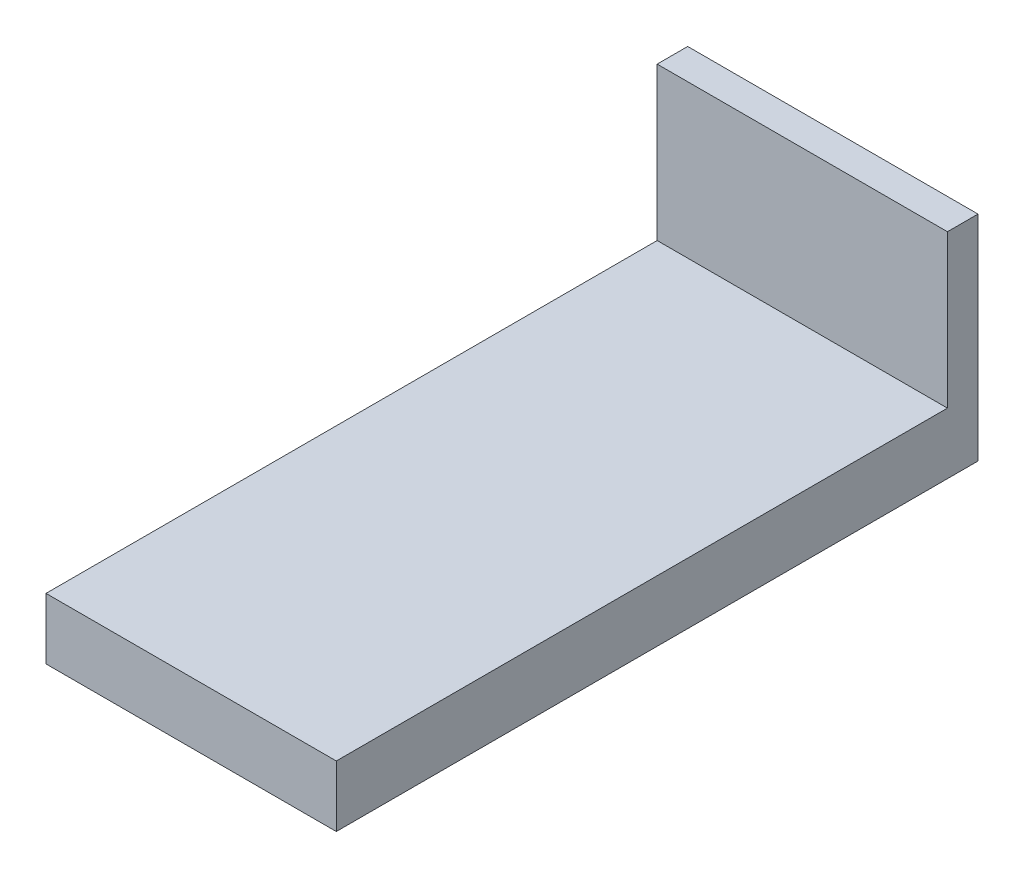
ISO-10303-21;
HEADER;
FILE_DESCRIPTION(('STEP AP214'),'2;1');
FILE_NAME('part.step','',(''),(''),'','','');
FILE_SCHEMA(('AUTOMOTIVE_DESIGN { 1 0 10303 214 1 1 1 1 }'));
ENDSEC;
DATA;
#1=APPLICATION_CONTEXT('core data for automotive mechanical design processes');
#2=APPLICATION_PROTOCOL_DEFINITION('international standard','automotive_design',2000,#1);
#3=PRODUCT_CONTEXT('',#1,'mechanical');
#4=PRODUCT('Part','Part','',(#3));
#5=PRODUCT_RELATED_PRODUCT_CATEGORY('part','',(#4));
#6=PRODUCT_DEFINITION_FORMATION('','',#4);
#7=PRODUCT_DEFINITION_CONTEXT('part definition',#1,'design');
#8=PRODUCT_DEFINITION('design','',#6,#7);
#9=PRODUCT_DEFINITION_SHAPE('','',#8);
#10=(LENGTH_UNIT() NAMED_UNIT(*) SI_UNIT(.MILLI.,.METRE.));
#11=(NAMED_UNIT(*) PLANE_ANGLE_UNIT() SI_UNIT($,.RADIAN.));
#12=(NAMED_UNIT(*) SI_UNIT($,.STERADIAN.) SOLID_ANGLE_UNIT());
#13=UNCERTAINTY_MEASURE_WITH_UNIT(LENGTH_MEASURE(1.E-05),#10,'distance_accuracy_value','');
#14=(GEOMETRIC_REPRESENTATION_CONTEXT(3) GLOBAL_UNCERTAINTY_ASSIGNED_CONTEXT((#13)) GLOBAL_UNIT_ASSIGNED_CONTEXT((#10,
#11,#12)) REPRESENTATION_CONTEXT('',''));
#15=CARTESIAN_POINT('',(0.,0.,0.));
#16=DIRECTION('',(0.,0.,1.));
#17=DIRECTION('',(1.,0.,0.));
#18=AXIS2_PLACEMENT_3D('',#15,#16,#17);
#19=CARTESIAN_POINT('',(475.,200.,-1000.));
#20=DIRECTION('',(-1.,0.,0.));
#21=DIRECTION('',(0.,0.,1.));
#22=AXIS2_PLACEMENT_3D('',#19,#20,#21);
#23=PLANE('',#22);
#24=DIRECTION('',(0.,0.,-1.));
#25=VECTOR('',#24,1.);
#26=CARTESIAN_POINT('',(475.,0.,-1000.));
#27=LINE('',#26,#25);
#28=CARTESIAN_POINT('',(475.,0.,1000.));
#29=VERTEX_POINT('',#28);
#30=CARTESIAN_POINT('',(475.,0.,-1100.));
#31=VERTEX_POINT('',#30);
#32=EDGE_CURVE('E86',#29,#31,#27,.T.);
#33=ORIENTED_EDGE('',*,*,#32,.T.);
#34=DIRECTION('',(0.,-1.,0.));
#35=VECTOR('',#34,1.);
#36=CARTESIAN_POINT('',(475.,700.,-1100.));
#37=LINE('',#36,#35);
#38=CARTESIAN_POINT('',(475.,700.,-1100.));
#39=VERTEX_POINT('',#38);
#40=EDGE_CURVE('E127',#39,#31,#37,.T.);
#41=ORIENTED_EDGE('',*,*,#40,.F.);
#42=DIRECTION('',(0.,0.,1.));
#43=VECTOR('',#42,1.);
#44=CARTESIAN_POINT('',(475.,700.,-1000.));
#45=LINE('',#44,#43);
#46=CARTESIAN_POINT('',(475.,700.,-1000.));
#47=VERTEX_POINT('',#46);
#48=EDGE_CURVE('E130',#39,#47,#45,.T.);
#49=ORIENTED_EDGE('',*,*,#48,.T.);
#50=DIRECTION('',(0.,-1.,0.));
#51=VECTOR('',#50,1.);
#52=CARTESIAN_POINT('',(475.,700.,-1000.));
#53=LINE('',#52,#51);
#54=CARTESIAN_POINT('',(475.,200.,-1000.));
#55=VERTEX_POINT('',#54);
#56=EDGE_CURVE('E87',#47,#55,#53,.T.);
#57=ORIENTED_EDGE('',*,*,#56,.T.);
#58=DIRECTION('',(0.,0.,-1.));
#59=VECTOR('',#58,1.);
#60=CARTESIAN_POINT('',(475.,200.,-1000.));
#61=LINE('',#60,#59);
#62=CARTESIAN_POINT('',(475.,200.,1000.));
#63=VERTEX_POINT('',#62);
#64=EDGE_CURVE('E92',#63,#55,#61,.T.);
#65=ORIENTED_EDGE('',*,*,#64,.F.);
#66=DIRECTION('',(0.,-1.,0.));
#67=VECTOR('',#66,1.);
#68=CARTESIAN_POINT('',(475.,200.,1000.));
#69=LINE('',#68,#67);
#70=EDGE_CURVE('E41',#63,#29,#69,.T.);
#71=ORIENTED_EDGE('',*,*,#70,.T.);
#72=EDGE_LOOP('',(#33,#41,#49,#57,#65,#71));
#73=FACE_BOUND('',#72,.T.);
#74=ADVANCED_FACE('F33',(#73),#23,.F.);
#75=CARTESIAN_POINT('',(-475.,200.,-1000.));
#76=DIRECTION('',(1.,0.,0.));
#77=DIRECTION('',(0.,0.,-1.));
#78=AXIS2_PLACEMENT_3D('',#75,#76,#77);
#79=PLANE('',#78);
#80=DIRECTION('',(0.,0.,1.));
#81=VECTOR('',#80,1.);
#82=CARTESIAN_POINT('',(-475.,0.,-1000.));
#83=LINE('',#82,#81);
#84=CARTESIAN_POINT('',(-475.,0.,-1100.));
#85=VERTEX_POINT('',#84);
#86=CARTESIAN_POINT('',(-475.,0.,1000.));
#87=VERTEX_POINT('',#86);
#88=EDGE_CURVE('E61',#85,#87,#83,.T.);
#89=ORIENTED_EDGE('',*,*,#88,.T.);
#90=DIRECTION('',(0.,-1.,0.));
#91=VECTOR('',#90,1.);
#92=CARTESIAN_POINT('',(-475.,200.,1000.));
#93=LINE('',#92,#91);
#94=CARTESIAN_POINT('',(-475.,200.,1000.));
#95=VERTEX_POINT('',#94);
#96=EDGE_CURVE('E11',#95,#87,#93,.T.);
#97=ORIENTED_EDGE('',*,*,#96,.F.);
#98=DIRECTION('',(0.,0.,1.));
#99=VECTOR('',#98,1.);
#100=CARTESIAN_POINT('',(-475.,200.,-1000.));
#101=LINE('',#100,#99);
#102=CARTESIAN_POINT('',(-475.,200.,-1000.));
#103=VERTEX_POINT('',#102);
#104=EDGE_CURVE('E90',#103,#95,#101,.T.);
#105=ORIENTED_EDGE('',*,*,#104,.F.);
#106=DIRECTION('',(0.,-1.,0.));
#107=VECTOR('',#106,1.);
#108=CARTESIAN_POINT('',(-475.,700.,-1000.));
#109=LINE('',#108,#107);
#110=CARTESIAN_POINT('',(-475.,700.,-1000.));
#111=VERTEX_POINT('',#110);
#112=EDGE_CURVE('E79',#111,#103,#109,.T.);
#113=ORIENTED_EDGE('',*,*,#112,.F.);
#114=DIRECTION('',(0.,0.,-1.));
#115=VECTOR('',#114,1.);
#116=CARTESIAN_POINT('',(-475.,700.,-1000.));
#117=LINE('',#116,#115);
#118=CARTESIAN_POINT('',(-475.,700.,-1100.));
#119=VERTEX_POINT('',#118);
#120=EDGE_CURVE('E119',#111,#119,#117,.T.);
#121=ORIENTED_EDGE('',*,*,#120,.T.);
#122=DIRECTION('',(0.,-1.,0.));
#123=VECTOR('',#122,1.);
#124=CARTESIAN_POINT('',(-475.,700.,-1100.));
#125=LINE('',#124,#123);
#126=EDGE_CURVE('E129',#119,#85,#125,.T.);
#127=ORIENTED_EDGE('',*,*,#126,.T.);
#128=EDGE_LOOP('',(#89,#97,#105,#113,#121,#127));
#129=FACE_BOUND('',#128,.T.);
#130=ADVANCED_FACE('F94',(#129),#79,.F.);
#131=CARTESIAN_POINT('',(-475.,200.,1000.));
#132=DIRECTION('',(0.,0.,-1.));
#133=DIRECTION('',(-1.,0.,0.));
#134=AXIS2_PLACEMENT_3D('',#131,#132,#133);
#135=PLANE('',#134);
#136=DIRECTION('',(1.,0.,0.));
#137=VECTOR('',#136,1.);
#138=CARTESIAN_POINT('',(-475.,0.,1000.));
#139=LINE('',#138,#137);
#140=EDGE_CURVE('E102',#87,#29,#139,.T.);
#141=ORIENTED_EDGE('',*,*,#140,.T.);
#142=ORIENTED_EDGE('',*,*,#70,.F.);
#143=DIRECTION('',(1.,0.,0.));
#144=VECTOR('',#143,1.);
#145=CARTESIAN_POINT('',(-475.,200.,1000.));
#146=LINE('',#145,#144);
#147=EDGE_CURVE('E49',#95,#63,#146,.T.);
#148=ORIENTED_EDGE('',*,*,#147,.F.);
#149=ORIENTED_EDGE('',*,*,#96,.T.);
#150=EDGE_LOOP('',(#141,#142,#148,#149));
#151=FACE_BOUND('',#150,.T.);
#152=ADVANCED_FACE('F154',(#151),#135,.F.);
#153=CARTESIAN_POINT('',(0.,200.,0.));
#154=DIRECTION('',(0.,1.,0.));
#155=DIRECTION('',(0.,0.,1.));
#156=AXIS2_PLACEMENT_3D('',#153,#154,#155);
#157=PLANE('',#156);
#158=ORIENTED_EDGE('',*,*,#64,.T.);
#159=DIRECTION('',(-1.,0.,0.));
#160=VECTOR('',#159,1.);
#161=CARTESIAN_POINT('',(-475.,200.,-1000.));
#162=LINE('',#161,#160);
#163=EDGE_CURVE('E70',#55,#103,#162,.T.);
#164=ORIENTED_EDGE('',*,*,#163,.T.);
#165=ORIENTED_EDGE('',*,*,#104,.T.);
#166=ORIENTED_EDGE('',*,*,#147,.T.);
#167=EDGE_LOOP('',(#158,#164,#165,#166));
#168=FACE_BOUND('',#167,.T.);
#169=ADVANCED_FACE('F89',(#168),#157,.T.);
#170=CARTESIAN_POINT('',(0.,0.,0.));
#171=DIRECTION('',(0.,1.,0.));
#172=DIRECTION('',(0.,0.,1.));
#173=AXIS2_PLACEMENT_3D('',#170,#171,#172);
#174=PLANE('',#173);
#175=ORIENTED_EDGE('',*,*,#32,.F.);
#176=ORIENTED_EDGE('',*,*,#140,.F.);
#177=ORIENTED_EDGE('',*,*,#88,.F.);
#178=DIRECTION('',(1.,0.,0.));
#179=VECTOR('',#178,1.);
#180=CARTESIAN_POINT('',(-475.,0.,-1100.));
#181=LINE('',#180,#179);
#182=EDGE_CURVE('E114',#85,#31,#181,.T.);
#183=ORIENTED_EDGE('',*,*,#182,.T.);
#184=EDGE_LOOP('',(#175,#176,#177,#183));
#185=FACE_BOUND('',#184,.T.);
#186=ADVANCED_FACE('F112',(#185),#174,.F.);
#187=CARTESIAN_POINT('',(-475.,700.,-1000.));
#188=DIRECTION('',(0.,0.,1.));
#189=DIRECTION('',(1.,0.,0.));
#190=AXIS2_PLACEMENT_3D('',#187,#188,#189);
#191=PLANE('',#190);
#192=ORIENTED_EDGE('',*,*,#163,.F.);
#193=ORIENTED_EDGE('',*,*,#56,.F.);
#194=DIRECTION('',(-1.,0.,0.));
#195=VECTOR('',#194,1.);
#196=CARTESIAN_POINT('',(-475.,700.,-1000.));
#197=LINE('',#196,#195);
#198=EDGE_CURVE('E82',#47,#111,#197,.T.);
#199=ORIENTED_EDGE('',*,*,#198,.T.);
#200=ORIENTED_EDGE('',*,*,#112,.T.);
#201=EDGE_LOOP('',(#192,#193,#199,#200));
#202=FACE_BOUND('',#201,.T.);
#203=ADVANCED_FACE('F80',(#202),#191,.T.);
#204=CARTESIAN_POINT('',(-475.,700.,-1100.));
#205=DIRECTION('',(0.,0.,-1.));
#206=DIRECTION('',(-1.,0.,0.));
#207=AXIS2_PLACEMENT_3D('',#204,#205,#206);
#208=PLANE('',#207);
#209=ORIENTED_EDGE('',*,*,#182,.F.);
#210=ORIENTED_EDGE('',*,*,#126,.F.);
#211=DIRECTION('',(1.,0.,0.));
#212=VECTOR('',#211,1.);
#213=CARTESIAN_POINT('',(-475.,700.,-1100.));
#214=LINE('',#213,#212);
#215=EDGE_CURVE('E121',#119,#39,#214,.T.);
#216=ORIENTED_EDGE('',*,*,#215,.T.);
#217=ORIENTED_EDGE('',*,*,#40,.T.);
#218=EDGE_LOOP('',(#209,#210,#216,#217));
#219=FACE_BOUND('',#218,.T.);
#220=ADVANCED_FACE('F137',(#219),#208,.T.);
#221=CARTESIAN_POINT('',(0.,700.,0.));
#222=DIRECTION('',(0.,-1.,0.));
#223=DIRECTION('',(0.,0.,-1.));
#224=AXIS2_PLACEMENT_3D('',#221,#222,#223);
#225=PLANE('',#224);
#226=ORIENTED_EDGE('',*,*,#120,.F.);
#227=ORIENTED_EDGE('',*,*,#198,.F.);
#228=ORIENTED_EDGE('',*,*,#48,.F.);
#229=ORIENTED_EDGE('',*,*,#215,.F.);
#230=EDGE_LOOP('',(#226,#227,#228,#229));
#231=FACE_BOUND('',#230,.T.);
#232=ADVANCED_FACE('F140',(#231),#225,.F.);
#233=CLOSED_SHELL('',(#74,#130,#152,#169,#186,#203,#220,#232));
#234=MANIFOLD_SOLID_BREP('B2',#233);
#235=ADVANCED_BREP_SHAPE_REPRESENTATION('',(#18,#234),#14);
#236=SHAPE_DEFINITION_REPRESENTATION(#9,#235);
ENDSEC;
END-ISO-10303-21;
